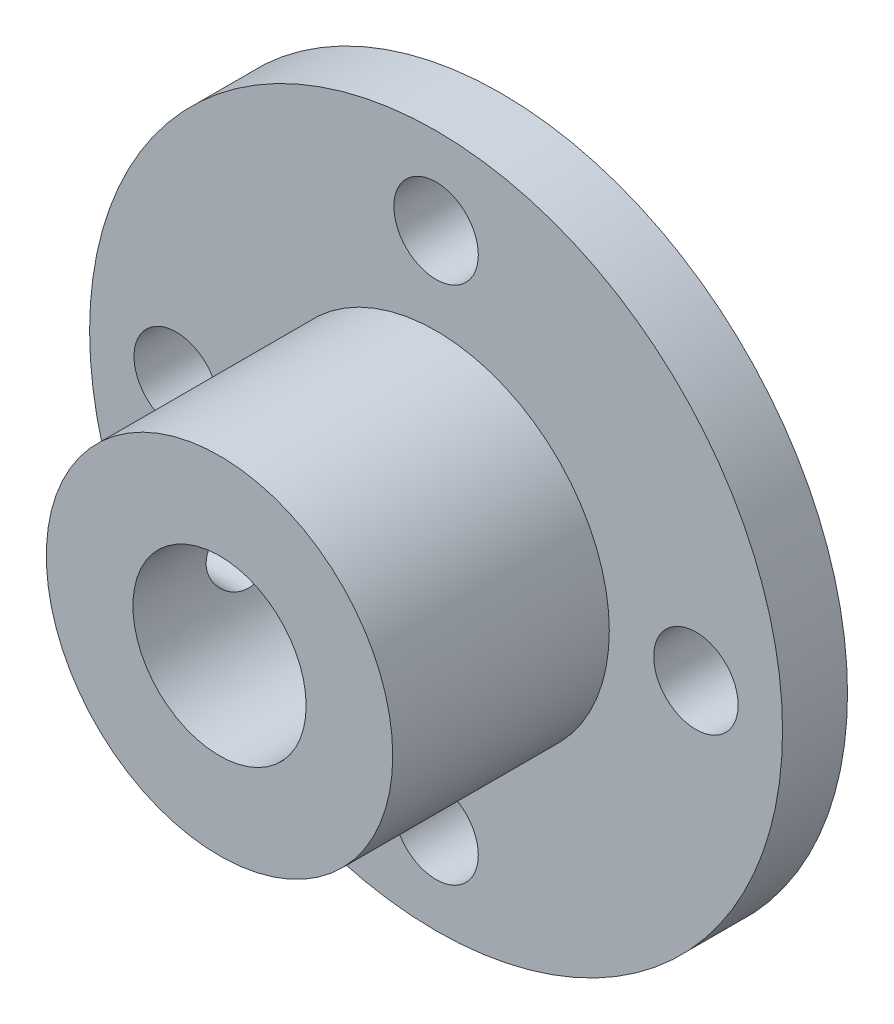
ISO-10303-21;
HEADER;
FILE_DESCRIPTION(('STEP AP214'),'2;1');
FILE_NAME('part.step','',(''),(''),'','','');
FILE_SCHEMA(('AUTOMOTIVE_DESIGN { 1 0 10303 214 1 1 1 1 }'));
ENDSEC;
DATA;
#1=APPLICATION_CONTEXT('core data for automotive mechanical design processes');
#2=APPLICATION_PROTOCOL_DEFINITION('international standard','automotive_design',2000,#1);
#3=PRODUCT_CONTEXT('',#1,'mechanical');
#4=PRODUCT('Part','Part','',(#3));
#5=PRODUCT_RELATED_PRODUCT_CATEGORY('part','',(#4));
#6=PRODUCT_DEFINITION_FORMATION('','',#4);
#7=PRODUCT_DEFINITION_CONTEXT('part definition',#1,'design');
#8=PRODUCT_DEFINITION('design','',#6,#7);
#9=PRODUCT_DEFINITION_SHAPE('','',#8);
#10=(LENGTH_UNIT() NAMED_UNIT(*) SI_UNIT(.MILLI.,.METRE.));
#11=(NAMED_UNIT(*) PLANE_ANGLE_UNIT() SI_UNIT($,.RADIAN.));
#12=(NAMED_UNIT(*) SI_UNIT($,.STERADIAN.) SOLID_ANGLE_UNIT());
#13=UNCERTAINTY_MEASURE_WITH_UNIT(LENGTH_MEASURE(1.E-05),#10,'distance_accuracy_value','');
#14=(GEOMETRIC_REPRESENTATION_CONTEXT(3) GLOBAL_UNCERTAINTY_ASSIGNED_CONTEXT((#13)) GLOBAL_UNIT_ASSIGNED_CONTEXT((#10,
#11,#12)) REPRESENTATION_CONTEXT('',''));
#15=CARTESIAN_POINT('',(0.,0.,0.));
#16=DIRECTION('',(0.,0.,1.));
#17=DIRECTION('',(1.,0.,0.));
#18=AXIS2_PLACEMENT_3D('',#15,#16,#17);
#19=CARTESIAN_POINT('',(0.,0.,0.));
#20=DIRECTION('',(0.,0.,1.));
#21=DIRECTION('',(1.,0.,0.));
#22=AXIS2_PLACEMENT_3D('',#19,#20,#21);
#23=CYLINDRICAL_SURFACE('',#22,16.);
#24=CARTESIAN_POINT('',(0.,0.,0.));
#25=DIRECTION('',(0.,0.,1.));
#26=DIRECTION('',(1.,0.,0.));
#27=AXIS2_PLACEMENT_3D('',#24,#25,#26);
#28=CIRCLE('',#27,16.);
#29=CARTESIAN_POINT('',(16.,0.,0.));
#30=VERTEX_POINT('',#29);
#31=EDGE_CURVE('E38',#30,#30,#28,.T.);
#32=ORIENTED_EDGE('',*,*,#31,.T.);
#33=EDGE_LOOP('',(#32));
#34=FACE_BOUND('',#33,.T.);
#35=CARTESIAN_POINT('',(0.,0.,3.));
#36=DIRECTION('',(0.,0.,1.));
#37=DIRECTION('',(1.,0.,0.));
#38=AXIS2_PLACEMENT_3D('',#35,#36,#37);
#39=CIRCLE('',#38,16.);
#40=CARTESIAN_POINT('',(16.,0.,3.));
#41=VERTEX_POINT('',#40);
#42=EDGE_CURVE('E46',#41,#41,#39,.T.);
#43=ORIENTED_EDGE('',*,*,#42,.F.);
#44=EDGE_LOOP('',(#43));
#45=FACE_BOUND('',#44,.T.);
#46=ADVANCED_FACE('F35',(#34,#45),#23,.T.);
#47=CARTESIAN_POINT('',(16.,0.,0.));
#48=DIRECTION('',(0.,0.,-1.));
#49=DIRECTION('',(-1.,0.,0.));
#50=AXIS2_PLACEMENT_3D('',#47,#48,#49);
#51=PLANE('',#50);
#52=CARTESIAN_POINT('',(0.,0.,0.));
#53=DIRECTION('',(0.,0.,1.));
#54=DIRECTION('',(1.,0.,0.));
#55=AXIS2_PLACEMENT_3D('',#52,#53,#54);
#56=CIRCLE('',#55,3.99999999999999);
#57=CARTESIAN_POINT('',(3.99999999999999,0.,0.));
#58=VERTEX_POINT('',#57);
#59=EDGE_CURVE('E82',#58,#58,#56,.T.);
#60=ORIENTED_EDGE('',*,*,#59,.T.);
#61=EDGE_LOOP('',(#60));
#62=FACE_BOUND('',#61,.T.);
#63=CARTESIAN_POINT('',(12.,0.,0.));
#64=DIRECTION('',(0.,0.,1.));
#65=DIRECTION('',(1.,0.,0.));
#66=AXIS2_PLACEMENT_3D('',#63,#64,#65);
#67=CIRCLE('',#66,1.94999999999999);
#68=CARTESIAN_POINT('',(13.95,0.,0.));
#69=VERTEX_POINT('',#68);
#70=EDGE_CURVE('E76',#69,#69,#67,.T.);
#71=ORIENTED_EDGE('',*,*,#70,.T.);
#72=EDGE_LOOP('',(#71));
#73=FACE_BOUND('',#72,.T.);
#74=CARTESIAN_POINT('',(0.,12.,0.));
#75=DIRECTION('',(0.,0.,1.));
#76=DIRECTION('',(1.,0.,0.));
#77=AXIS2_PLACEMENT_3D('',#74,#75,#76);
#78=CIRCLE('',#77,1.94999999999999);
#79=CARTESIAN_POINT('',(1.94999999999999,12.,0.));
#80=VERTEX_POINT('',#79);
#81=EDGE_CURVE('E70',#80,#80,#78,.T.);
#82=ORIENTED_EDGE('',*,*,#81,.T.);
#83=EDGE_LOOP('',(#82));
#84=FACE_BOUND('',#83,.T.);
#85=CARTESIAN_POINT('',(-12.,0.,0.));
#86=DIRECTION('',(0.,0.,1.));
#87=DIRECTION('',(1.,0.,0.));
#88=AXIS2_PLACEMENT_3D('',#85,#86,#87);
#89=CIRCLE('',#88,1.94999999999999);
#90=CARTESIAN_POINT('',(-10.05,0.,0.));
#91=VERTEX_POINT('',#90);
#92=EDGE_CURVE('E62',#91,#91,#89,.T.);
#93=ORIENTED_EDGE('',*,*,#92,.T.);
#94=EDGE_LOOP('',(#93));
#95=FACE_BOUND('',#94,.T.);
#96=CARTESIAN_POINT('',(0.,-12.,0.));
#97=DIRECTION('',(0.,0.,1.));
#98=DIRECTION('',(1.,0.,0.));
#99=AXIS2_PLACEMENT_3D('',#96,#97,#98);
#100=CIRCLE('',#99,1.94999999999999);
#101=CARTESIAN_POINT('',(1.94999999999999,-12.,0.));
#102=VERTEX_POINT('',#101);
#103=EDGE_CURVE('E54',#102,#102,#100,.T.);
#104=ORIENTED_EDGE('',*,*,#103,.T.);
#105=EDGE_LOOP('',(#104));
#106=FACE_BOUND('',#105,.T.);
#107=ORIENTED_EDGE('',*,*,#31,.F.);
#108=EDGE_LOOP('',(#107));
#109=FACE_BOUND('',#108,.T.);
#110=ADVANCED_FACE('F141',(#62,#73,#84,#95,#106,#109),#51,.T.);
#111=CARTESIAN_POINT('',(0.,0.,3.));
#112=DIRECTION('',(0.,0.,1.));
#113=DIRECTION('',(1.,0.,0.));
#114=AXIS2_PLACEMENT_3D('',#111,#112,#113);
#115=PLANE('',#114);
#116=CARTESIAN_POINT('',(12.,0.,3.));
#117=DIRECTION('',(0.,0.,1.));
#118=DIRECTION('',(1.,0.,0.));
#119=AXIS2_PLACEMENT_3D('',#116,#117,#118);
#120=CIRCLE('',#119,1.94999999999999);
#121=CARTESIAN_POINT('',(13.95,0.,3.));
#122=VERTEX_POINT('',#121);
#123=EDGE_CURVE('E79',#122,#122,#120,.T.);
#124=ORIENTED_EDGE('',*,*,#123,.F.);
#125=EDGE_LOOP('',(#124));
#126=FACE_BOUND('',#125,.T.);
#127=CARTESIAN_POINT('',(0.,12.,3.));
#128=DIRECTION('',(0.,0.,1.));
#129=DIRECTION('',(1.,0.,0.));
#130=AXIS2_PLACEMENT_3D('',#127,#128,#129);
#131=CIRCLE('',#130,1.94999999999999);
#132=CARTESIAN_POINT('',(1.94999999999999,12.,3.));
#133=VERTEX_POINT('',#132);
#134=EDGE_CURVE('E73',#133,#133,#131,.T.);
#135=ORIENTED_EDGE('',*,*,#134,.F.);
#136=EDGE_LOOP('',(#135));
#137=FACE_BOUND('',#136,.T.);
#138=CARTESIAN_POINT('',(-12.,0.,3.));
#139=DIRECTION('',(0.,0.,1.));
#140=DIRECTION('',(1.,0.,0.));
#141=AXIS2_PLACEMENT_3D('',#138,#139,#140);
#142=CIRCLE('',#141,1.94999999999999);
#143=CARTESIAN_POINT('',(-10.05,0.,3.));
#144=VERTEX_POINT('',#143);
#145=EDGE_CURVE('E67',#144,#144,#142,.T.);
#146=ORIENTED_EDGE('',*,*,#145,.F.);
#147=EDGE_LOOP('',(#146));
#148=FACE_BOUND('',#147,.T.);
#149=CARTESIAN_POINT('',(0.,-12.,3.));
#150=DIRECTION('',(0.,0.,1.));
#151=DIRECTION('',(1.,0.,0.));
#152=AXIS2_PLACEMENT_3D('',#149,#150,#151);
#153=CIRCLE('',#152,1.94999999999999);
#154=CARTESIAN_POINT('',(1.94999999999999,-12.,3.));
#155=VERTEX_POINT('',#154);
#156=EDGE_CURVE('E58',#155,#155,#153,.T.);
#157=ORIENTED_EDGE('',*,*,#156,.F.);
#158=EDGE_LOOP('',(#157));
#159=FACE_BOUND('',#158,.T.);
#160=CARTESIAN_POINT('',(0.,0.,3.));
#161=DIRECTION('',(0.,0.,1.));
#162=DIRECTION('',(1.,0.,0.));
#163=AXIS2_PLACEMENT_3D('',#160,#161,#162);
#164=CIRCLE('',#163,8.);
#165=CARTESIAN_POINT('',(8.,0.,3.));
#166=VERTEX_POINT('',#165);
#167=EDGE_CURVE('E10',#166,#166,#164,.T.);
#168=ORIENTED_EDGE('',*,*,#167,.F.);
#169=EDGE_LOOP('',(#168));
#170=FACE_BOUND('',#169,.T.);
#171=ORIENTED_EDGE('',*,*,#42,.T.);
#172=EDGE_LOOP('',(#171));
#173=FACE_BOUND('',#172,.T.);
#174=ADVANCED_FACE('F137',(#126,#137,#148,#159,#170,#173),#115,.T.);
#175=CARTESIAN_POINT('',(0.,0.,13.));
#176=DIRECTION('',(0.,0.,-1.));
#177=DIRECTION('',(-1.,0.,0.));
#178=AXIS2_PLACEMENT_3D('',#175,#176,#177);
#179=CYLINDRICAL_SURFACE('',#178,8.);
#180=CARTESIAN_POINT('',(-8.,0.,9.61999999999999));
#181=CARTESIAN_POINT('',(-7.99999833800551,-0.0900107716000097,9.61999671716189));
#182=CARTESIAN_POINT('',(-7.99846531477622,-0.180062801152134,9.61247285994238));
#183=CARTESIAN_POINT('',(-7.99249767668564,-0.357619851496443,9.58260106425009));
#184=CARTESIAN_POINT('',(-7.98806078650456,-0.445122818771393,9.56024150109666));
#185=CARTESIAN_POINT('',(-7.97678067369675,-0.614989039293261,9.50141864637687));
#186=CARTESIAN_POINT('',(-7.96993978358095,-0.697357183781481,9.46496902245145));
#187=CARTESIAN_POINT('',(-7.95459465133156,-0.854803578054056,9.37904169644302));
#188=CARTESIAN_POINT('',(-7.94609050097131,-0.929882229707312,9.32956471311568));
#189=CARTESIAN_POINT('',(-7.92822240723281,-1.07166483522701,9.21825996150073));
#190=CARTESIAN_POINT('',(-7.91884909481401,-1.13825315875964,9.15628639034748));
#191=CARTESIAN_POINT('',(-7.90036698996907,-1.26016349992559,9.02206104095816));
#192=CARTESIAN_POINT('',(-7.89125821861025,-1.31548462236797,8.94980844681694));
#193=CARTESIAN_POINT('',(-7.87424492703357,-1.41378468404827,8.79624130702948));
#194=CARTESIAN_POINT('',(-7.866352455433,-1.45664345998895,8.71484839039153));
#195=CARTESIAN_POINT('',(-7.85279862437874,-1.5280322914127,8.54583025995697));
#196=CARTESIAN_POINT('',(-7.84713703864811,-1.55656380017945,8.45820567929783));
#197=CARTESIAN_POINT('',(-7.83878088024279,-1.59811193624012,8.2804569792838));
#198=CARTESIAN_POINT('',(-7.83604750123306,-1.61133168014736,8.19038219951961));
#199=CARTESIAN_POINT('',(-7.8337404681286,-1.62251201183133,8.00925491178587));
#200=CARTESIAN_POINT('',(-7.83416648263499,-1.62047420002164,7.91820250736295));
#201=CARTESIAN_POINT('',(-7.83809486009048,-1.60136138948832,7.73919371190637));
#202=CARTESIAN_POINT('',(-7.84154950372396,-1.58451963204052,7.65121121392619));
#203=CARTESIAN_POINT('',(-7.85107071123185,-1.53664534331484,7.47934689800161));
#204=CARTESIAN_POINT('',(-7.85713740267015,-1.50561211896749,7.39546528055363));
#205=CARTESIAN_POINT('',(-7.87124770271284,-1.4300142096277,7.23351376796667));
#206=CARTESIAN_POINT('',(-7.87930469232976,-1.38535743350572,7.15548807453517));
#207=CARTESIAN_POINT('',(-7.89647922847941,-1.28384501034215,7.00795037892688));
#208=CARTESIAN_POINT('',(-7.90559689977723,-1.22698792754623,6.93843938028859));
#209=CARTESIAN_POINT('',(-7.92407194372615,-1.10144186766838,6.80855876101006));
#210=CARTESIAN_POINT('',(-7.93343063487394,-1.03255391472698,6.74838149864037));
#211=CARTESIAN_POINT('',(-7.95117927046121,-0.885561868384965,6.64040578643592));
#212=CARTESIAN_POINT('',(-7.95956920186912,-0.807457651037565,6.59260750310997));
#213=CARTESIAN_POINT('',(-7.97445642256128,-0.644033785509743,6.51070945811651));
#214=CARTESIAN_POINT('',(-7.98095061197068,-0.558702610605459,6.47663209847113));
#215=CARTESIAN_POINT('',(-7.9912911720106,-0.383365538524094,6.42335054625457));
#216=CARTESIAN_POINT('',(-7.99513787160592,-0.293360223629171,6.40414450580516));
#217=CARTESIAN_POINT('',(-7.99970408951475,-0.112882408378436,6.38142407166444));
#218=CARTESIAN_POINT('',(-8.0004760516232,-0.0224443264645996,6.37764649603461));
#219=CARTESIAN_POINT('',(-7.99895164940363,0.15777074562173,6.38518085481981));
#220=CARTESIAN_POINT('',(-7.99665546210096,0.247547773635043,6.39649191865407));
#221=CARTESIAN_POINT('',(-7.98928561697146,0.42304030049953,6.43366387414482));
#222=CARTESIAN_POINT('',(-7.98423782274431,0.508785666109845,6.45938934016343));
#223=CARTESIAN_POINT('',(-7.97192881490427,0.67474558990391,6.52451156227843));
#224=CARTESIAN_POINT('',(-7.96466743238218,0.754959725450833,6.56390936168232));
#225=CARTESIAN_POINT('',(-7.94860625543898,0.90868736310515,6.65582453408833));
#226=CARTESIAN_POINT('',(-7.93978835225606,0.982104489103872,6.70849986394158));
#227=CARTESIAN_POINT('',(-7.92163408402737,1.11915187363511,6.82526379328398));
#228=CARTESIAN_POINT('',(-7.91229766197362,1.18278105313181,6.88935364944708));
#229=CARTESIAN_POINT('',(-7.89398128444095,1.29946530295812,7.02832673863867));
#230=CARTESIAN_POINT('',(-7.8850091849598,1.35233948644762,7.10336306353931));
#231=CARTESIAN_POINT('',(-7.86860558680935,1.444734275395,7.26140656403282));
#232=CARTESIAN_POINT('',(-7.86117402571412,1.48425542198762,7.34441341644319));
#233=CARTESIAN_POINT('',(-7.84875676666128,1.54857732160783,7.51561912837372));
#234=CARTESIAN_POINT('',(-7.84375824919953,1.57345537639313,7.60378797131614));
#235=CARTESIAN_POINT('',(-7.83674635117866,1.60801841771527,7.78316676276906));
#236=CARTESIAN_POINT('',(-7.83473257025661,1.61770544193806,7.87437630173186));
#237=CARTESIAN_POINT('',(-7.83394077258144,1.62153455083086,8.05543030199342));
#238=CARTESIAN_POINT('',(-7.83510323315984,1.61596258407305,8.14526857696887));
#239=CARTESIAN_POINT('',(-7.8403997380124,1.59006402549795,8.32269870685585));
#240=CARTESIAN_POINT('',(-7.84453375707103,1.56973755888175,8.41029058082295));
#241=CARTESIAN_POINT('',(-7.85528065113004,1.51503594795429,8.58055373385495));
#242=CARTESIAN_POINT('',(-7.86188718618655,1.48069671454076,8.66323697651673));
#243=CARTESIAN_POINT('',(-7.87683818711264,1.39897750868699,8.82171297832921));
#244=CARTESIAN_POINT('',(-7.88518280335676,1.35159640778215,8.8975051404649));
#245=CARTESIAN_POINT('',(-7.90285130906802,1.2441654190296,9.04146957207795));
#246=CARTESIAN_POINT('',(-7.91218971582046,1.18390936984586,9.10948624384977));
#247=CARTESIAN_POINT('',(-7.93069028533669,1.0528635879862,9.23453737706406));
#248=CARTESIAN_POINT('',(-7.93985240708902,0.982071436835601,9.29156931013748));
#249=CARTESIAN_POINT('',(-7.95708461531325,0.831045725072381,9.39361357647795));
#250=CARTESIAN_POINT('',(-7.96514186816278,0.75071863255553,9.43848974409063));
#251=CARTESIAN_POINT('',(-7.97912991421666,0.583521743492166,9.51403504673443));
#252=CARTESIAN_POINT('',(-7.98506260605599,0.496657873049315,9.54471687387251));
#253=CARTESIAN_POINT('',(-7.99299251755571,0.341343488399894,9.58512083051151));
#254=CARTESIAN_POINT('',(-7.99560483111465,0.273771820451287,9.5981769930426));
#255=CARTESIAN_POINT('',(-7.99910917838125,0.137474765628231,9.61561768699881));
#256=CARTESIAN_POINT('',(-8.00000126941644,0.0687494172779302,9.62000250740219));
#257=CARTESIAN_POINT('',(-8.,0.,9.61999999999999));
#258=B_SPLINE_CURVE_WITH_KNOTS('',3,(#180,#181,#182,#183,#184,#185,#186,#187,#188,#189,#190,
#191,#192,#193,#194,#195,#196,#197,#198,#199,#200,#201,#202,#203,#204,#205,#206,#207,#208,#209,
#210,#211,#212,#213,#214,#215,#216,#217,#218,#219,#220,#221,#222,#223,#224,#225,#226,#227,#228,
#229,#230,#231,#232,#233,#234,#235,#236,#237,#238,#239,#240,#241,#242,#243,#244,#245,#246,#247,
#248,#249,#250,#251,#252,#253,#254,#255,#256,#257),.UNSPECIFIED.,.T.,.F.,(4,2,2,2,2,2,2,2,2,2,2,
2,2,2,2,2,2,2,2,2,2,2,2,2,2,2,2,2,2,2,2,2,2,2,2,2,2,2,4),(0.,0.26978079060092,0.539773220942452,
0.80950440776863,1.07922071589189,1.3522878283728,1.62537662786604,1.90101732899325,
2.17663006490658,2.4485432309038,2.72042787546356,2.98810415443225,3.2557935073188,
3.52533403427217,3.79490629865954,4.06945304933315,4.34400349272471,4.61900039186239,
4.89396311498911,5.16421536470315,5.43445202214097,5.70219133549988,5.96995108398651,
6.24106043509756,6.51219965226616,6.78757826673469,7.06294572008557,7.33684614253875,
7.61070982154709,7.87947667791055,8.1482412536471,8.41632134196422,8.68442463355602,
8.95719461443286,9.23002730423541,9.50580044632264,9.78132652235933,9.98738952957613,
10.1934456694903),.UNSPECIFIED.);
#259=CARTESIAN_POINT('',(-8.,0.,9.61999999999999));
#260=VERTEX_POINT('',#259);
#261=EDGE_CURVE('E88',#260,#260,#258,.T.);
#262=ORIENTED_EDGE('',*,*,#261,.T.);
#263=EDGE_LOOP('',(#262));
#264=FACE_BOUND('',#263,.T.);
#265=CARTESIAN_POINT('',(0.,0.,13.));
#266=DIRECTION('',(0.,0.,1.));
#267=DIRECTION('',(1.,0.,0.));
#268=AXIS2_PLACEMENT_3D('',#265,#266,#267);
#269=CIRCLE('',#268,8.);
#270=CARTESIAN_POINT('',(8.,0.,13.));
#271=VERTEX_POINT('',#270);
#272=EDGE_CURVE('E48',#271,#271,#269,.T.);
#273=ORIENTED_EDGE('',*,*,#272,.F.);
#274=EDGE_LOOP('',(#273));
#275=FACE_BOUND('',#274,.T.);
#276=ORIENTED_EDGE('',*,*,#167,.T.);
#277=EDGE_LOOP('',(#276));
#278=FACE_BOUND('',#277,.T.);
#279=ADVANCED_FACE('F101',(#264,#275,#278),#179,.T.);
#280=CARTESIAN_POINT('',(0.,0.,13.));
#281=DIRECTION('',(0.,0.,1.));
#282=DIRECTION('',(1.,0.,0.));
#283=AXIS2_PLACEMENT_3D('',#280,#281,#282);
#284=PLANE('',#283);
#285=CARTESIAN_POINT('',(0.,0.,13.));
#286=DIRECTION('',(0.,0.,1.));
#287=DIRECTION('',(1.,0.,0.));
#288=AXIS2_PLACEMENT_3D('',#285,#286,#287);
#289=CIRCLE('',#288,3.99999999999999);
#290=CARTESIAN_POINT('',(3.99999999999999,0.,13.));
#291=VERTEX_POINT('',#290);
#292=EDGE_CURVE('E85',#291,#291,#289,.T.);
#293=ORIENTED_EDGE('',*,*,#292,.F.);
#294=EDGE_LOOP('',(#293));
#295=FACE_BOUND('',#294,.T.);
#296=ORIENTED_EDGE('',*,*,#272,.T.);
#297=EDGE_LOOP('',(#296));
#298=FACE_BOUND('',#297,.T.);
#299=ADVANCED_FACE('F130',(#295,#298),#284,.T.);
#300=CARTESIAN_POINT('',(0.,-12.,3.));
#301=DIRECTION('',(0.,0.,1.));
#302=DIRECTION('',(1.,0.,0.));
#303=AXIS2_PLACEMENT_3D('',#300,#301,#302);
#304=CYLINDRICAL_SURFACE('',#303,1.94999999999999);
#305=ORIENTED_EDGE('',*,*,#103,.F.);
#306=EDGE_LOOP('',(#305));
#307=FACE_BOUND('',#306,.T.);
#308=ORIENTED_EDGE('',*,*,#156,.T.);
#309=EDGE_LOOP('',(#308));
#310=FACE_BOUND('',#309,.T.);
#311=ADVANCED_FACE('F127',(#307,#310),#304,.F.);
#312=CARTESIAN_POINT('',(-12.,0.,3.));
#313=DIRECTION('',(0.,0.,1.));
#314=DIRECTION('',(1.,0.,0.));
#315=AXIS2_PLACEMENT_3D('',#312,#313,#314);
#316=CYLINDRICAL_SURFACE('',#315,1.94999999999999);
#317=ORIENTED_EDGE('',*,*,#92,.F.);
#318=EDGE_LOOP('',(#317));
#319=FACE_BOUND('',#318,.T.);
#320=ORIENTED_EDGE('',*,*,#145,.T.);
#321=EDGE_LOOP('',(#320));
#322=FACE_BOUND('',#321,.T.);
#323=ADVANCED_FACE('F123',(#319,#322),#316,.F.);
#324=CARTESIAN_POINT('',(0.,12.,3.));
#325=DIRECTION('',(0.,0.,1.));
#326=DIRECTION('',(1.,0.,0.));
#327=AXIS2_PLACEMENT_3D('',#324,#325,#326);
#328=CYLINDRICAL_SURFACE('',#327,1.94999999999999);
#329=ORIENTED_EDGE('',*,*,#81,.F.);
#330=EDGE_LOOP('',(#329));
#331=FACE_BOUND('',#330,.T.);
#332=ORIENTED_EDGE('',*,*,#134,.T.);
#333=EDGE_LOOP('',(#332));
#334=FACE_BOUND('',#333,.T.);
#335=ADVANCED_FACE('F119',(#331,#334),#328,.F.);
#336=CARTESIAN_POINT('',(12.,0.,3.));
#337=DIRECTION('',(0.,0.,1.));
#338=DIRECTION('',(1.,0.,0.));
#339=AXIS2_PLACEMENT_3D('',#336,#337,#338);
#340=CYLINDRICAL_SURFACE('',#339,1.94999999999999);
#341=ORIENTED_EDGE('',*,*,#70,.F.);
#342=EDGE_LOOP('',(#341));
#343=FACE_BOUND('',#342,.T.);
#344=ORIENTED_EDGE('',*,*,#123,.T.);
#345=EDGE_LOOP('',(#344));
#346=FACE_BOUND('',#345,.T.);
#347=ADVANCED_FACE('F115',(#343,#346),#340,.F.);
#348=CARTESIAN_POINT('',(0.,0.,13.));
#349=DIRECTION('',(0.,0.,1.));
#350=DIRECTION('',(1.,0.,0.));
#351=AXIS2_PLACEMENT_3D('',#348,#349,#350);
#352=CYLINDRICAL_SURFACE('',#351,3.99999999999999);
#353=CARTESIAN_POINT('',(-3.99999999999999,0.,9.61999999999999));
#354=CARTESIAN_POINT('',(-3.99999372288453,0.0869826804315326,9.61999155626175));
#355=CARTESIAN_POINT('',(-3.99712958970312,0.174112271981058,9.61295271151578));
#356=CARTESIAN_POINT('',(-3.98595098803369,0.345911485336523,9.58504282680692));
#357=CARTESIAN_POINT('',(-3.97762187539992,0.430573857476063,9.56413462036819));
#358=CARTESIAN_POINT('',(-3.95641015084319,0.594675329636483,9.5093754599772));
#359=CARTESIAN_POINT('',(-3.94354261379588,0.674130701583001,9.47556732450117));
#360=CARTESIAN_POINT('',(-3.91451709915269,0.826168449158404,9.39613991235134));
#361=CARTESIAN_POINT('',(-3.89836022075646,0.898753108934857,9.35052457991174));
#362=CARTESIAN_POINT('',(-3.86351690647394,1.03858350877017,9.24646227824643));
#363=CARTESIAN_POINT('',(-3.84475065439086,1.10545597020537,9.18754065417374));
#364=CARTESIAN_POINT('',(-3.8071624639609,1.22868747812746,9.05954064554654));
#365=CARTESIAN_POINT('',(-3.78834050251804,1.28504126710812,8.99045721253592));
#366=CARTESIAN_POINT('',(-3.75180999473569,1.38818469090096,8.84024737403699));
#367=CARTESIAN_POINT('',(-3.73419215556731,1.43441687860239,8.75871384791955));
#368=CARTESIAN_POINT('',(-3.70332081810137,1.51234418354666,8.58820829259541));
#369=CARTESIAN_POINT('',(-3.69006519569244,1.54404637889818,8.49923991021572));
#370=CARTESIAN_POINT('',(-3.67027809681971,1.5904946338832,8.32068197248704));
#371=CARTESIAN_POINT('',(-3.66346421782517,1.60595650339217,8.231311077834));
#372=CARTESIAN_POINT('',(-3.65651539344379,1.62172044491158,8.05100351043191));
#373=CARTESIAN_POINT('',(-3.6563770486657,1.62203023283796,7.96006765821039));
#374=CARTESIAN_POINT('',(-3.66255457923265,1.60802269150077,7.7861631022157));
#375=CARTESIAN_POINT('',(-3.66840862327363,1.59475202387683,7.70309046777695));
#376=CARTESIAN_POINT('',(-3.68513461254141,1.55570856092698,7.54047175909627));
#377=CARTESIAN_POINT('',(-3.69600745797709,1.52993352268346,7.46092632032465));
#378=CARTESIAN_POINT('',(-3.72178691443448,1.4661183511726,7.30567339377991));
#379=CARTESIAN_POINT('',(-3.73677229876766,1.42783558329917,7.23007930326412));
#380=CARTESIAN_POINT('',(-3.76906768650677,1.34026233989645,7.08610541828146));
#381=CARTESIAN_POINT('',(-3.78637857551144,1.29096766604865,7.01772839001817));
#382=CARTESIAN_POINT('',(-3.82304849717437,1.17816964828384,6.88441435864795));
#383=CARTESIAN_POINT('',(-3.84246100133937,1.11384875246792,6.82018191407981));
#384=CARTESIAN_POINT('',(-3.8799805407562,0.975145413956612,6.7031866290629));
#385=CARTESIAN_POINT('',(-3.89808730230534,0.900760871117889,6.65042618866984));
#386=CARTESIAN_POINT('',(-3.93142961879736,0.742001174566824,6.55691626000053));
#387=CARTESIAN_POINT('',(-3.94659793266585,0.657450995629588,6.51643819601539));
#388=CARTESIAN_POINT('',(-3.97184370036166,0.481970842800368,6.45052407165911));
#389=CARTESIAN_POINT('',(-3.98192380723708,0.391044221884193,6.4250801711239));
#390=CARTESIAN_POINT('',(-3.99537029723005,0.21129273958092,6.39139625223911));
#391=CARTESIAN_POINT('',(-3.99910547770839,0.122672747458049,6.38220978268271));
#392=CARTESIAN_POINT('',(-4.00060755653573,-0.054913071111592,6.37849883971662));
#393=CARTESIAN_POINT('',(-3.9983760502817,-0.14387879876247,6.3839704469715));
#394=CARTESIAN_POINT('',(-3.98843629131867,-0.315298774586737,6.40872972266922));
#395=CARTESIAN_POINT('',(-3.98098644818418,-0.397863773343922,6.42736584560264));
#396=CARTESIAN_POINT('',(-3.96162954995225,-0.558614719929591,6.4770326146773));
#397=CARTESIAN_POINT('',(-3.94972192480748,-0.636800106236163,6.5080648460285));
#398=CARTESIAN_POINT('',(-3.92214563835159,-0.789280837683628,6.58265691294667));
#399=CARTESIAN_POINT('',(-3.90637255674194,-0.863382554923078,6.62657272704172));
#400=CARTESIAN_POINT('',(-3.8727676537834,-1.00342691364947,6.72529162442478));
#401=CARTESIAN_POINT('',(-3.85493499744105,-1.06936622332626,6.78009912996115));
#402=CARTESIAN_POINT('',(-3.81765289462907,-1.1958962197562,6.90339072997303));
#403=CARTESIAN_POINT('',(-3.79817568216785,-1.25582332977798,6.97254920459415));
#404=CARTESIAN_POINT('',(-3.76090602935631,-1.36339099598824,7.12027583858237));
#405=CARTESIAN_POINT('',(-3.74311389667463,-1.41102931116555,7.19884571041207));
#406=CARTESIAN_POINT('',(-3.71117667181763,-1.49302863600161,7.36447466883356));
#407=CARTESIAN_POINT('',(-3.69707376557169,-1.52723813032915,7.45161748855428));
#408=CARTESIAN_POINT('',(-3.67474242869789,-1.58022481767234,7.63117258516603));
#409=CARTESIAN_POINT('',(-3.66650951387692,-1.59901379236471,7.72358078133406));
#410=CARTESIAN_POINT('',(-3.65750946674729,-1.61948695281646,7.90372606906683));
#411=CARTESIAN_POINT('',(-3.65623816924894,-1.62232662330607,7.9913074079244));
#412=CARTESIAN_POINT('',(-3.65997890374669,-1.61386986961043,8.16563927100128));
#413=CARTESIAN_POINT('',(-3.66499009156339,-1.60257534464154,8.25238990526446));
#414=CARTESIAN_POINT('',(-3.68028157575084,-1.56712270970315,8.41889740190544));
#415=CARTESIAN_POINT('',(-3.69033422879669,-1.54351872754628,8.49879508669197));
#416=CARTESIAN_POINT('',(-3.71441019392721,-1.48464243613186,8.65352430013546));
#417=CARTESIAN_POINT('',(-3.72843460836632,-1.44936688699609,8.7283544151437));
#418=CARTESIAN_POINT('',(-3.75988618732135,-1.36578094478063,8.87556754969902));
#419=CARTESIAN_POINT('',(-3.77746379979666,-1.31683185447496,8.94755523518221));
#420=CARTESIAN_POINT('',(-3.81359427155116,-1.20821019577165,9.08265722842233));
#421=CARTESIAN_POINT('',(-3.83214743685228,-1.14853424808797,9.14576872871127));
#422=CARTESIAN_POINT('',(-3.86963633493741,-1.01538487507376,9.26568052489874));
#423=CARTESIAN_POINT('',(-3.88851405122236,-0.941253905338962,9.32177211357535));
#424=CARTESIAN_POINT('',(-3.92325748999468,-0.783920108921072,9.42074035051401));
#425=CARTESIAN_POINT('',(-3.93912182099825,-0.700713119008513,9.46361089939789));
#426=CARTESIAN_POINT('',(-3.96579325384342,-0.529051104296264,9.53393520167315));
#427=CARTESIAN_POINT('',(-3.9766865593121,-0.440718079895817,9.56165353700552));
#428=CARTESIAN_POINT('',(-3.99254202847934,-0.260278397392655,9.60160494221472));
#429=CARTESIAN_POINT('',(-3.99752293845403,-0.16818462930393,9.61388696293056));
#430=CARTESIAN_POINT('',(-3.99976202643277,-0.050571513710704,9.61941050907721));
#431=CARTESIAN_POINT('',(-4.00000182519781,-0.0252919673232165,9.62000245518706));
#432=CARTESIAN_POINT('',(-3.99999999999999,0.,9.61999999999999));
#433=B_SPLINE_CURVE_WITH_KNOTS('',3,(#353,#354,#355,#356,#357,#358,#359,#360,#361,#362,#363,
#364,#365,#366,#367,#368,#369,#370,#371,#372,#373,#374,#375,#376,#377,#378,#379,#380,#381,#382,
#383,#384,#385,#386,#387,#388,#389,#390,#391,#392,#393,#394,#395,#396,#397,#398,#399,#400,#401,
#402,#403,#404,#405,#406,#407,#408,#409,#410,#411,#412,#413,#414,#415,#416,#417,#418,#419,#420,
#421,#422,#423,#424,#425,#426,#427,#428,#429,#430,#431,#432),.UNSPECIFIED.,.T.,.F.,(4,2,2,2,2,2,
2,2,2,2,2,2,2,2,2,2,2,2,2,2,2,2,2,2,2,2,2,2,2,2,2,2,2,2,2,2,2,2,2,4),(0.,0.260879133234718,
0.522460197848929,0.783180450293305,1.04381372040209,1.31586684105368,1.58805557892404,
1.87273271355016,2.15727102339923,2.42866157718003,2.6999139289256,2.95172697497915,
3.20358520562236,3.46065221206402,3.71781739376297,3.9954077337174,4.27305609253266,
4.55645549355909,4.83970697393189,5.10584685464045,5.37191558090227,5.6256628647285,
5.87944260806085,6.14102841134817,6.40272064159458,6.68211579475637,6.96156186305958,
7.2440759999025,7.52637408715484,7.7879274870944,8.04944574579326,8.30009513632878,
8.55081416239494,8.81611257241845,9.08149470644835,9.36470321505631,9.64804218394808,
9.92626124325031,10.2035957841406,10.2794516497031),.UNSPECIFIED.);
#434=CARTESIAN_POINT('',(-3.99999999999999,0.,9.61999999999999));
#435=VERTEX_POINT('',#434);
#436=EDGE_CURVE('E96',#435,#435,#433,.T.);
#437=ORIENTED_EDGE('',*,*,#436,.T.);
#438=EDGE_LOOP('',(#437));
#439=FACE_BOUND('',#438,.T.);
#440=ORIENTED_EDGE('',*,*,#59,.F.);
#441=EDGE_LOOP('',(#440));
#442=FACE_BOUND('',#441,.T.);
#443=ORIENTED_EDGE('',*,*,#292,.T.);
#444=EDGE_LOOP('',(#443));
#445=FACE_BOUND('',#444,.T.);
#446=ADVANCED_FACE('F108',(#439,#442,#445),#352,.F.);
#447=CARTESIAN_POINT('',(-8.,0.,8.));
#448=DIRECTION('',(-1.,0.,0.));
#449=DIRECTION('',(0.,0.,1.));
#450=AXIS2_PLACEMENT_3D('',#447,#448,#449);
#451=CYLINDRICAL_SURFACE('',#450,1.61999999999999);
#452=ORIENTED_EDGE('',*,*,#436,.F.);
#453=EDGE_LOOP('',(#452));
#454=FACE_BOUND('',#453,.T.);
#455=ORIENTED_EDGE('',*,*,#261,.F.);
#456=EDGE_LOOP('',(#455));
#457=FACE_BOUND('',#456,.T.);
#458=ADVANCED_FACE('F105',(#454,#457),#451,.F.);
#459=CLOSED_SHELL('',(#46,#110,#174,#279,#299,#311,#323,#335,#347,#446,#458));
#460=MANIFOLD_SOLID_BREP('B2',#459);
#461=ADVANCED_BREP_SHAPE_REPRESENTATION('',(#18,#460),#14);
#462=SHAPE_DEFINITION_REPRESENTATION(#9,#461);
ENDSEC;
END-ISO-10303-21;
